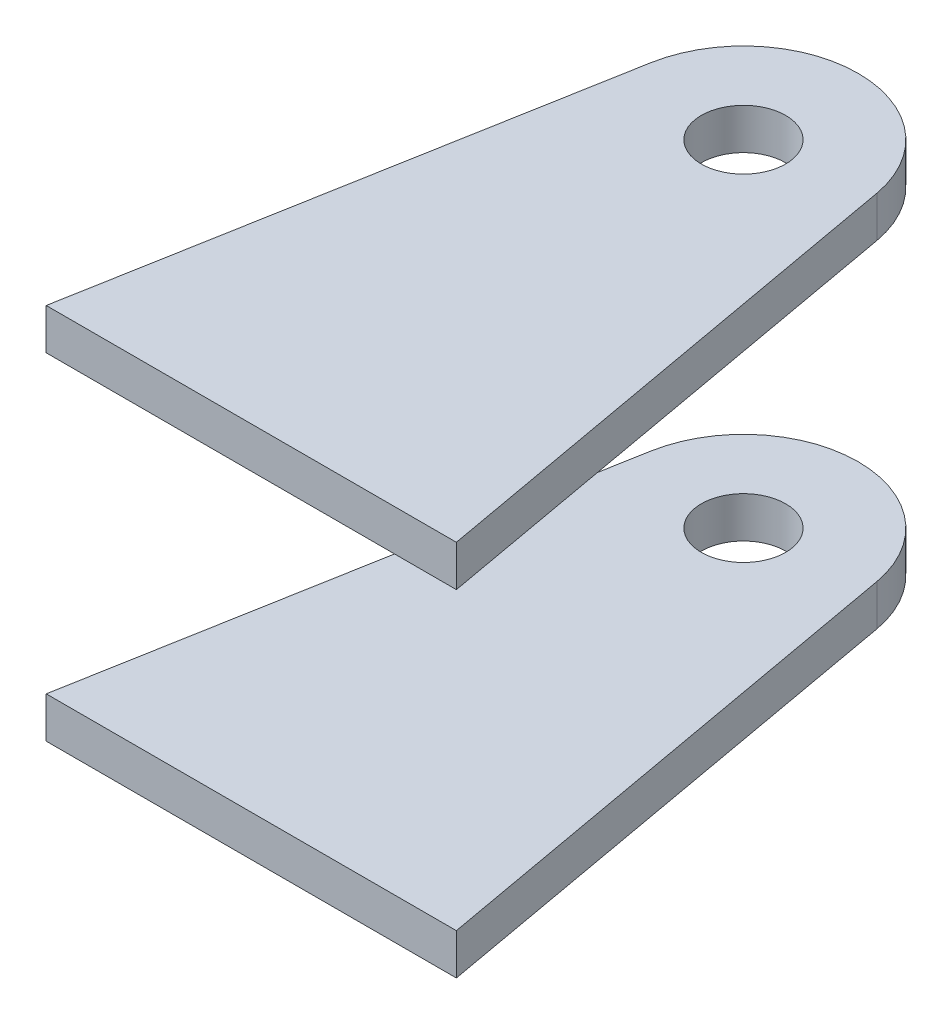
ISO-10303-21;
HEADER;
FILE_DESCRIPTION(('STEP AP214'),'2;1');
FILE_NAME('part.step','',(''),(''),'','','');
FILE_SCHEMA(('AUTOMOTIVE_DESIGN { 1 0 10303 214 1 1 1 1 }'));
ENDSEC;
DATA;
#1=APPLICATION_CONTEXT('core data for automotive mechanical design processes');
#2=APPLICATION_PROTOCOL_DEFINITION('international standard','automotive_design',2000,#1);
#3=PRODUCT_CONTEXT('',#1,'mechanical');
#4=PRODUCT('Part','Part','',(#3));
#5=PRODUCT_RELATED_PRODUCT_CATEGORY('part','',(#4));
#6=PRODUCT_DEFINITION_FORMATION('','',#4);
#7=PRODUCT_DEFINITION_CONTEXT('part definition',#1,'design');
#8=PRODUCT_DEFINITION('design','',#6,#7);
#9=PRODUCT_DEFINITION_SHAPE('','',#8);
#10=(LENGTH_UNIT() NAMED_UNIT(*) SI_UNIT(.MILLI.,.METRE.));
#11=(NAMED_UNIT(*) PLANE_ANGLE_UNIT() SI_UNIT($,.RADIAN.));
#12=(NAMED_UNIT(*) SI_UNIT($,.STERADIAN.) SOLID_ANGLE_UNIT());
#13=UNCERTAINTY_MEASURE_WITH_UNIT(LENGTH_MEASURE(1.E-05),#10,'distance_accuracy_value','');
#14=(GEOMETRIC_REPRESENTATION_CONTEXT(3) GLOBAL_UNCERTAINTY_ASSIGNED_CONTEXT((#13)) GLOBAL_UNIT_ASSIGNED_CONTEXT((#10,
#11,#12)) REPRESENTATION_CONTEXT('',''));
#15=CARTESIAN_POINT('',(0.,0.,0.));
#16=DIRECTION('',(0.,0.,1.));
#17=DIRECTION('',(1.,0.,0.));
#18=AXIS2_PLACEMENT_3D('',#15,#16,#17);
#19=CARTESIAN_POINT('',(0.,-14.605,38.1));
#20=DIRECTION('',(0.,0.,-1.));
#21=DIRECTION('',(1.,0.,0.));
#22=AXIS2_PLACEMENT_3D('',#19,#20,#21);
#23=PLANE('',#22);
#24=DIRECTION('',(1.,0.,0.));
#25=VECTOR('',#24,1.);
#26=CARTESIAN_POINT('',(0.,-11.43,38.1));
#27=LINE('',#26,#25);
#28=CARTESIAN_POINT('',(-15.875,-11.43,38.1));
#29=VERTEX_POINT('',#28);
#30=CARTESIAN_POINT('',(15.875,-11.43,38.1));
#31=VERTEX_POINT('',#30);
#32=EDGE_CURVE('E121',#29,#31,#27,.T.);
#33=ORIENTED_EDGE('',*,*,#32,.F.);
#34=DIRECTION('',(0.,1.,0.));
#35=VECTOR('',#34,1.);
#36=CARTESIAN_POINT('',(-15.875,-14.605,38.1));
#37=LINE('',#36,#35);
#38=CARTESIAN_POINT('',(-15.875,-14.605,38.1));
#39=VERTEX_POINT('',#38);
#40=EDGE_CURVE('E56',#39,#29,#37,.T.);
#41=ORIENTED_EDGE('',*,*,#40,.F.);
#42=DIRECTION('',(1.,0.,0.));
#43=VECTOR('',#42,1.);
#44=CARTESIAN_POINT('',(0.,-14.605,38.1));
#45=LINE('',#44,#43);
#46=CARTESIAN_POINT('',(15.875,-14.605,38.1));
#47=VERTEX_POINT('',#46);
#48=EDGE_CURVE('E107',#39,#47,#45,.T.);
#49=ORIENTED_EDGE('',*,*,#48,.T.);
#50=DIRECTION('',(0.,1.,0.));
#51=VECTOR('',#50,1.);
#52=CARTESIAN_POINT('',(15.875,-14.605,38.1));
#53=LINE('',#52,#51);
#54=EDGE_CURVE('E12',#47,#31,#53,.T.);
#55=ORIENTED_EDGE('',*,*,#54,.T.);
#56=EDGE_LOOP('',(#33,#41,#49,#55));
#57=FACE_BOUND('',#56,.T.);
#58=ADVANCED_FACE('F53',(#57),#23,.F.);
#59=CARTESIAN_POINT('',(8.74999934873621,-14.605,-1.57149972864009));
#60=DIRECTION('',(0.984251895245918,0.,-0.176771623019133));
#61=DIRECTION('',(0.176771623019133,0.,0.984251895245918));
#62=AXIS2_PLACEMENT_3D('',#59,#60,#61);
#63=PLANE('',#62);
#64=DIRECTION('',(0.176771623019133,0.,0.984251895245918));
#65=VECTOR('',#64,1.);
#66=CARTESIAN_POINT('',(8.74999934873621,-11.43,-1.57149972864009));
#67=LINE('',#66,#65);
#68=CARTESIAN_POINT('',(8.74999934873621,-11.43,-1.57149972864009));
#69=VERTEX_POINT('',#68);
#70=EDGE_CURVE('E94',#69,#31,#67,.T.);
#71=ORIENTED_EDGE('',*,*,#70,.T.);
#72=ORIENTED_EDGE('',*,*,#54,.F.);
#73=DIRECTION('',(0.176771623019133,0.,0.984251895245918));
#74=VECTOR('',#73,1.);
#75=CARTESIAN_POINT('',(8.74999934873621,-14.605,-1.57149972864009));
#76=LINE('',#75,#74);
#77=CARTESIAN_POINT('',(8.74999934873621,-14.605,-1.57149972864009));
#78=VERTEX_POINT('',#77);
#79=EDGE_CURVE('E71',#78,#47,#76,.T.);
#80=ORIENTED_EDGE('',*,*,#79,.F.);
#81=DIRECTION('',(0.,1.,0.));
#82=VECTOR('',#81,1.);
#83=CARTESIAN_POINT('',(8.74999934873621,-14.605,-1.57149972864009));
#84=LINE('',#83,#82);
#85=EDGE_CURVE('E62',#78,#69,#84,.T.);
#86=ORIENTED_EDGE('',*,*,#85,.T.);
#87=EDGE_LOOP('',(#71,#72,#80,#86));
#88=FACE_BOUND('',#87,.T.);
#89=ADVANCED_FACE('F130',(#88),#63,.T.);
#90=CARTESIAN_POINT('',(0.,-14.605,0.));
#91=DIRECTION('',(0.,1.,0.));
#92=DIRECTION('',(0.,0.,-1.));
#93=AXIS2_PLACEMENT_3D('',#90,#91,#92);
#94=CYLINDRICAL_SURFACE('',#93,8.89);
#95=CARTESIAN_POINT('',(0.,-11.43,0.));
#96=DIRECTION('',(0.,-1.,0.));
#97=DIRECTION('',(0.,0.,-1.));
#98=AXIS2_PLACEMENT_3D('',#95,#96,#97);
#99=CIRCLE('',#98,8.89);
#100=CARTESIAN_POINT('',(-8.74999934873621,-11.43,-1.57149972864009));
#101=VERTEX_POINT('',#100);
#102=EDGE_CURVE('E88',#101,#69,#99,.T.);
#103=ORIENTED_EDGE('',*,*,#102,.T.);
#104=ORIENTED_EDGE('',*,*,#85,.F.);
#105=CARTESIAN_POINT('',(0.,-14.605,0.));
#106=DIRECTION('',(0.,-1.,0.));
#107=DIRECTION('',(0.,0.,-1.));
#108=AXIS2_PLACEMENT_3D('',#105,#106,#107);
#109=CIRCLE('',#108,8.89);
#110=CARTESIAN_POINT('',(-8.74999934873621,-14.605,-1.57149972864009));
#111=VERTEX_POINT('',#110);
#112=EDGE_CURVE('E105',#111,#78,#109,.T.);
#113=ORIENTED_EDGE('',*,*,#112,.F.);
#114=DIRECTION('',(0.,1.,0.));
#115=VECTOR('',#114,1.);
#116=CARTESIAN_POINT('',(-8.74999934873621,-14.605,-1.57149972864009));
#117=LINE('',#116,#115);
#118=EDGE_CURVE('E110',#111,#101,#117,.T.);
#119=ORIENTED_EDGE('',*,*,#118,.T.);
#120=EDGE_LOOP('',(#103,#104,#113,#119));
#121=FACE_BOUND('',#120,.T.);
#122=ADVANCED_FACE('F113',(#121),#94,.T.);
#123=CARTESIAN_POINT('',(-8.74999934873621,-14.605,-1.57149972864009));
#124=DIRECTION('',(0.984251895245918,0.,0.176771623019133));
#125=DIRECTION('',(-0.176771623019133,0.,0.984251895245918));
#126=AXIS2_PLACEMENT_3D('',#123,#124,#125);
#127=PLANE('',#126);
#128=DIRECTION('',(-0.176771623019133,0.,0.984251895245918));
#129=VECTOR('',#128,1.);
#130=CARTESIAN_POINT('',(-8.74999934873621,-11.43,-1.57149972864009));
#131=LINE('',#130,#129);
#132=EDGE_CURVE('E112',#101,#29,#131,.T.);
#133=ORIENTED_EDGE('',*,*,#132,.F.);
#134=ORIENTED_EDGE('',*,*,#118,.F.);
#135=DIRECTION('',(-0.176771623019133,0.,0.984251895245918));
#136=VECTOR('',#135,1.);
#137=CARTESIAN_POINT('',(-8.74999934873621,-14.605,-1.57149972864009));
#138=LINE('',#137,#136);
#139=EDGE_CURVE('E101',#111,#39,#138,.T.);
#140=ORIENTED_EDGE('',*,*,#139,.T.);
#141=ORIENTED_EDGE('',*,*,#40,.T.);
#142=EDGE_LOOP('',(#133,#134,#140,#141));
#143=FACE_BOUND('',#142,.T.);
#144=ADVANCED_FACE('F111',(#143),#127,.F.);
#145=CARTESIAN_POINT('',(0.,-14.605,0.));
#146=DIRECTION('',(0.,1.,0.));
#147=DIRECTION('',(0.,0.,-1.));
#148=AXIS2_PLACEMENT_3D('',#145,#146,#147);
#149=CYLINDRICAL_SURFACE('',#148,3.2639);
#150=CARTESIAN_POINT('',(0.,-14.605,0.));
#151=DIRECTION('',(0.,-1.,0.));
#152=DIRECTION('',(0.,0.,-1.));
#153=AXIS2_PLACEMENT_3D('',#150,#151,#152);
#154=CIRCLE('',#153,3.2639);
#155=CARTESIAN_POINT('',(0.,-14.605,-3.2639));
#156=VERTEX_POINT('',#155);
#157=EDGE_CURVE('E115',#156,#156,#154,.T.);
#158=ORIENTED_EDGE('',*,*,#157,.T.);
#159=EDGE_LOOP('',(#158));
#160=FACE_BOUND('',#159,.T.);
#161=CARTESIAN_POINT('',(0.,-11.43,0.));
#162=DIRECTION('',(0.,-1.,0.));
#163=DIRECTION('',(0.,0.,-1.));
#164=AXIS2_PLACEMENT_3D('',#161,#162,#163);
#165=CIRCLE('',#164,3.2639);
#166=CARTESIAN_POINT('',(0.,-11.43,-3.2639));
#167=VERTEX_POINT('',#166);
#168=EDGE_CURVE('E127',#167,#167,#165,.T.);
#169=ORIENTED_EDGE('',*,*,#168,.F.);
#170=EDGE_LOOP('',(#169));
#171=FACE_BOUND('',#170,.T.);
#172=ADVANCED_FACE('F146',(#160,#171),#149,.F.);
#173=CARTESIAN_POINT('',(0.,-14.605,0.));
#174=DIRECTION('',(0.,1.,0.));
#175=DIRECTION('',(0.,0.,-1.));
#176=AXIS2_PLACEMENT_3D('',#173,#174,#175);
#177=PLANE('',#176);
#178=ORIENTED_EDGE('',*,*,#48,.F.);
#179=ORIENTED_EDGE('',*,*,#139,.F.);
#180=ORIENTED_EDGE('',*,*,#112,.T.);
#181=ORIENTED_EDGE('',*,*,#79,.T.);
#182=EDGE_LOOP('',(#178,#179,#180,#181));
#183=FACE_BOUND('',#182,.T.);
#184=ORIENTED_EDGE('',*,*,#157,.F.);
#185=EDGE_LOOP('',(#184));
#186=FACE_BOUND('',#185,.T.);
#187=ADVANCED_FACE('F102',(#183,#186),#177,.F.);
#188=CARTESIAN_POINT('',(0.,-11.43,0.));
#189=DIRECTION('',(0.,1.,0.));
#190=DIRECTION('',(0.,0.,-1.));
#191=AXIS2_PLACEMENT_3D('',#188,#189,#190);
#192=PLANE('',#191);
#193=ORIENTED_EDGE('',*,*,#32,.T.);
#194=ORIENTED_EDGE('',*,*,#70,.F.);
#195=ORIENTED_EDGE('',*,*,#102,.F.);
#196=ORIENTED_EDGE('',*,*,#132,.T.);
#197=EDGE_LOOP('',(#193,#194,#195,#196));
#198=FACE_BOUND('',#197,.T.);
#199=ORIENTED_EDGE('',*,*,#168,.T.);
#200=EDGE_LOOP('',(#199));
#201=FACE_BOUND('',#200,.T.);
#202=ADVANCED_FACE('F132',(#198,#201),#192,.T.);
#203=CLOSED_SHELL('',(#58,#89,#122,#144,#172,#187,#202));
#204=MANIFOLD_SOLID_BREP('B2',#203);
#205=CARTESIAN_POINT('',(-8.74999934873621,14.605,-1.57149972864009));
#206=DIRECTION('',(-0.984251895245918,0.,-0.176771623019133));
#207=DIRECTION('',(0.176771623019133,0.,-0.984251895245918));
#208=AXIS2_PLACEMENT_3D('',#205,#206,#207);
#209=PLANE('',#208);
#210=DIRECTION('',(-0.176771623019133,0.,0.984251895245918));
#211=VECTOR('',#210,1.);
#212=CARTESIAN_POINT('',(-8.74999934873621,11.43,-1.57149972864009));
#213=LINE('',#212,#211);
#214=CARTESIAN_POINT('',(-8.74999934873621,11.43,-1.57149972864009));
#215=VERTEX_POINT('',#214);
#216=CARTESIAN_POINT('',(-15.875,11.43,38.1));
#217=VERTEX_POINT('',#216);
#218=EDGE_CURVE('E278',#215,#217,#213,.T.);
#219=ORIENTED_EDGE('',*,*,#218,.T.);
#220=DIRECTION('',(0.,-1.,0.));
#221=VECTOR('',#220,1.);
#222=CARTESIAN_POINT('',(-15.875,14.605,38.1));
#223=LINE('',#222,#221);
#224=CARTESIAN_POINT('',(-15.875,14.605,38.1));
#225=VERTEX_POINT('',#224);
#226=EDGE_CURVE('E277',#225,#217,#223,.T.);
#227=ORIENTED_EDGE('',*,*,#226,.F.);
#228=DIRECTION('',(-0.176771623019133,0.,0.984251895245918));
#229=VECTOR('',#228,1.);
#230=CARTESIAN_POINT('',(-8.74999934873621,14.605,-1.57149972864009));
#231=LINE('',#230,#229);
#232=CARTESIAN_POINT('',(-8.74999934873621,14.605,-1.57149972864009));
#233=VERTEX_POINT('',#232);
#234=EDGE_CURVE('E268',#233,#225,#231,.T.);
#235=ORIENTED_EDGE('',*,*,#234,.F.);
#236=DIRECTION('',(0.,-1.,0.));
#237=VECTOR('',#236,1.);
#238=CARTESIAN_POINT('',(-8.74999934873621,14.605,-1.57149972864009));
#239=LINE('',#238,#237);
#240=EDGE_CURVE('E51',#233,#215,#239,.T.);
#241=ORIENTED_EDGE('',*,*,#240,.T.);
#242=EDGE_LOOP('',(#219,#227,#235,#241));
#243=FACE_BOUND('',#242,.T.);
#244=ADVANCED_FACE('F210',(#243),#209,.T.);
#245=CARTESIAN_POINT('',(0.,14.605,0.));
#246=DIRECTION('',(0.,-1.,0.));
#247=DIRECTION('',(0.,0.,1.));
#248=AXIS2_PLACEMENT_3D('',#245,#246,#247);
#249=CYLINDRICAL_SURFACE('',#248,8.89);
#250=CARTESIAN_POINT('',(0.,11.43,0.));
#251=DIRECTION('',(0.,-1.,0.));
#252=DIRECTION('',(0.,0.,-1.));
#253=AXIS2_PLACEMENT_3D('',#250,#251,#252);
#254=CIRCLE('',#253,8.89);
#255=CARTESIAN_POINT('',(8.74999934873621,11.43,-1.57149972864009));
#256=VERTEX_POINT('',#255);
#257=EDGE_CURVE('E281',#215,#256,#254,.T.);
#258=ORIENTED_EDGE('',*,*,#257,.F.);
#259=ORIENTED_EDGE('',*,*,#240,.F.);
#260=CARTESIAN_POINT('',(0.,14.605,0.));
#261=DIRECTION('',(0.,-1.,0.));
#262=DIRECTION('',(0.,0.,-1.));
#263=AXIS2_PLACEMENT_3D('',#260,#261,#262);
#264=CIRCLE('',#263,8.89);
#265=CARTESIAN_POINT('',(8.74999934873621,14.605,-1.57149972864009));
#266=VERTEX_POINT('',#265);
#267=EDGE_CURVE('E251',#233,#266,#264,.T.);
#268=ORIENTED_EDGE('',*,*,#267,.T.);
#269=DIRECTION('',(0.,-1.,0.));
#270=VECTOR('',#269,1.);
#271=CARTESIAN_POINT('',(8.74999934873621,14.605,-1.57149972864009));
#272=LINE('',#271,#270);
#273=EDGE_CURVE('E218',#266,#256,#272,.T.);
#274=ORIENTED_EDGE('',*,*,#273,.T.);
#275=EDGE_LOOP('',(#258,#259,#268,#274));
#276=FACE_BOUND('',#275,.T.);
#277=ADVANCED_FACE('F266',(#276),#249,.T.);
#278=CARTESIAN_POINT('',(8.74999934873621,14.605,-1.57149972864009));
#279=DIRECTION('',(-0.984251895245918,0.,0.176771623019133));
#280=DIRECTION('',(-0.176771623019133,0.,-0.984251895245918));
#281=AXIS2_PLACEMENT_3D('',#278,#279,#280);
#282=PLANE('',#281);
#283=DIRECTION('',(0.176771623019133,0.,0.984251895245918));
#284=VECTOR('',#283,1.);
#285=CARTESIAN_POINT('',(8.74999934873621,11.43,-1.57149972864009));
#286=LINE('',#285,#284);
#287=CARTESIAN_POINT('',(15.875,11.43,38.1));
#288=VERTEX_POINT('',#287);
#289=EDGE_CURVE('E262',#256,#288,#286,.T.);
#290=ORIENTED_EDGE('',*,*,#289,.F.);
#291=ORIENTED_EDGE('',*,*,#273,.F.);
#292=DIRECTION('',(0.176771623019133,0.,0.984251895245918));
#293=VECTOR('',#292,1.);
#294=CARTESIAN_POINT('',(8.74999934873621,14.605,-1.57149972864009));
#295=LINE('',#294,#293);
#296=CARTESIAN_POINT('',(15.875,14.605,38.1));
#297=VERTEX_POINT('',#296);
#298=EDGE_CURVE('E254',#266,#297,#295,.T.);
#299=ORIENTED_EDGE('',*,*,#298,.T.);
#300=DIRECTION('',(0.,-1.,0.));
#301=VECTOR('',#300,1.);
#302=CARTESIAN_POINT('',(15.875,14.605,38.1));
#303=LINE('',#302,#301);
#304=EDGE_CURVE('E265',#297,#288,#303,.T.);
#305=ORIENTED_EDGE('',*,*,#304,.T.);
#306=EDGE_LOOP('',(#290,#291,#299,#305));
#307=FACE_BOUND('',#306,.T.);
#308=ADVANCED_FACE('F261',(#307),#282,.F.);
#309=CARTESIAN_POINT('',(0.,14.605,38.1));
#310=DIRECTION('',(0.,0.,1.));
#311=DIRECTION('',(-1.,0.,0.));
#312=AXIS2_PLACEMENT_3D('',#309,#310,#311);
#313=PLANE('',#312);
#314=DIRECTION('',(1.,0.,0.));
#315=VECTOR('',#314,1.);
#316=CARTESIAN_POINT('',(0.,11.43,38.1));
#317=LINE('',#316,#315);
#318=EDGE_CURVE('E240',#217,#288,#317,.T.);
#319=ORIENTED_EDGE('',*,*,#318,.T.);
#320=ORIENTED_EDGE('',*,*,#304,.F.);
#321=DIRECTION('',(1.,0.,0.));
#322=VECTOR('',#321,1.);
#323=CARTESIAN_POINT('',(0.,14.605,38.1));
#324=LINE('',#323,#322);
#325=EDGE_CURVE('E226',#225,#297,#324,.T.);
#326=ORIENTED_EDGE('',*,*,#325,.F.);
#327=ORIENTED_EDGE('',*,*,#226,.T.);
#328=EDGE_LOOP('',(#319,#320,#326,#327));
#329=FACE_BOUND('',#328,.T.);
#330=ADVANCED_FACE('F292',(#329),#313,.T.);
#331=CARTESIAN_POINT('',(0.,14.605,0.));
#332=DIRECTION('',(0.,-1.,0.));
#333=DIRECTION('',(0.,0.,1.));
#334=AXIS2_PLACEMENT_3D('',#331,#332,#333);
#335=CYLINDRICAL_SURFACE('',#334,3.2639);
#336=CARTESIAN_POINT('',(0.,14.605,0.));
#337=DIRECTION('',(0.,-1.,0.));
#338=DIRECTION('',(0.,0.,-1.));
#339=AXIS2_PLACEMENT_3D('',#336,#337,#338);
#340=CIRCLE('',#339,3.2639);
#341=CARTESIAN_POINT('',(0.,14.605,-3.2639));
#342=VERTEX_POINT('',#341);
#343=EDGE_CURVE('E274',#342,#342,#340,.T.);
#344=ORIENTED_EDGE('',*,*,#343,.F.);
#345=EDGE_LOOP('',(#344));
#346=FACE_BOUND('',#345,.T.);
#347=CARTESIAN_POINT('',(0.,11.43,0.));
#348=DIRECTION('',(0.,-1.,0.));
#349=DIRECTION('',(0.,0.,-1.));
#350=AXIS2_PLACEMENT_3D('',#347,#348,#349);
#351=CIRCLE('',#350,3.2639);
#352=CARTESIAN_POINT('',(0.,11.43,-3.2639));
#353=VERTEX_POINT('',#352);
#354=EDGE_CURVE('E270',#353,#353,#351,.T.);
#355=ORIENTED_EDGE('',*,*,#354,.T.);
#356=EDGE_LOOP('',(#355));
#357=FACE_BOUND('',#356,.T.);
#358=ADVANCED_FACE('F294',(#346,#357),#335,.F.);
#359=CARTESIAN_POINT('',(0.,14.605,0.));
#360=DIRECTION('',(0.,1.,0.));
#361=DIRECTION('',(0.,0.,-1.));
#362=AXIS2_PLACEMENT_3D('',#359,#360,#361);
#363=PLANE('',#362);
#364=ORIENTED_EDGE('',*,*,#234,.T.);
#365=ORIENTED_EDGE('',*,*,#325,.T.);
#366=ORIENTED_EDGE('',*,*,#298,.F.);
#367=ORIENTED_EDGE('',*,*,#267,.F.);
#368=EDGE_LOOP('',(#364,#365,#366,#367));
#369=FACE_BOUND('',#368,.T.);
#370=ORIENTED_EDGE('',*,*,#343,.T.);
#371=EDGE_LOOP('',(#370));
#372=FACE_BOUND('',#371,.T.);
#373=ADVANCED_FACE('F256',(#369,#372),#363,.T.);
#374=CARTESIAN_POINT('',(0.,11.43,0.));
#375=DIRECTION('',(0.,1.,0.));
#376=DIRECTION('',(0.,0.,-1.));
#377=AXIS2_PLACEMENT_3D('',#374,#375,#376);
#378=PLANE('',#377);
#379=ORIENTED_EDGE('',*,*,#218,.F.);
#380=ORIENTED_EDGE('',*,*,#257,.T.);
#381=ORIENTED_EDGE('',*,*,#289,.T.);
#382=ORIENTED_EDGE('',*,*,#318,.F.);
#383=EDGE_LOOP('',(#379,#380,#381,#382));
#384=FACE_BOUND('',#383,.T.);
#385=ORIENTED_EDGE('',*,*,#354,.F.);
#386=EDGE_LOOP('',(#385));
#387=FACE_BOUND('',#386,.T.);
#388=ADVANCED_FACE('F288',(#384,#387),#378,.F.);
#389=CLOSED_SHELL('',(#244,#277,#308,#330,#358,#373,#388));
#390=MANIFOLD_SOLID_BREP('B6',#389);
#391=ADVANCED_BREP_SHAPE_REPRESENTATION('',(#18,#204,#390),#14);
#392=SHAPE_DEFINITION_REPRESENTATION(#9,#391);
ENDSEC;
END-ISO-10303-21;
